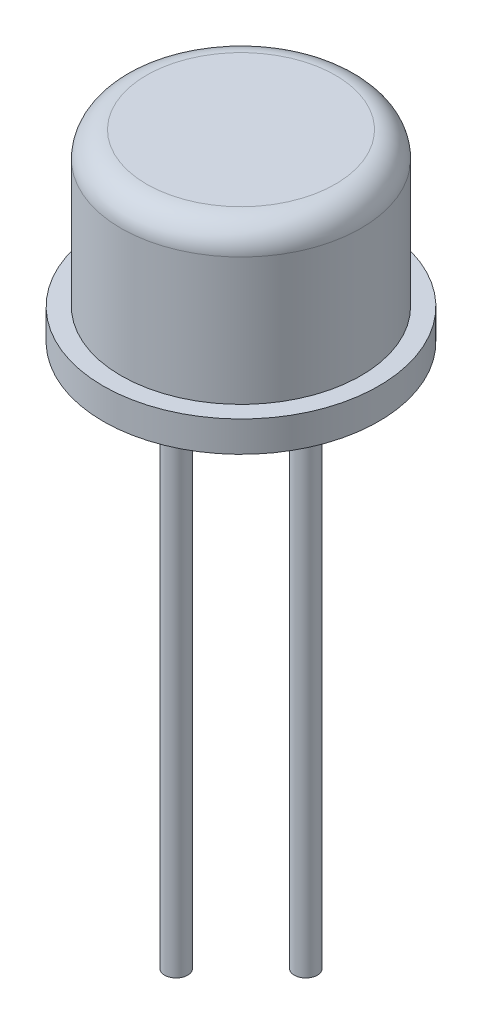
ISO-10303-21;
HEADER;
FILE_DESCRIPTION(('STEP AP214'),'2;1');
FILE_NAME('part.step','',(''),(''),'','','');
FILE_SCHEMA(('AUTOMOTIVE_DESIGN { 1 0 10303 214 1 1 1 1 }'));
ENDSEC;
DATA;
#1=APPLICATION_CONTEXT('core data for automotive mechanical design processes');
#2=APPLICATION_PROTOCOL_DEFINITION('international standard','automotive_design',2000,#1);
#3=PRODUCT_CONTEXT('',#1,'mechanical');
#4=PRODUCT('Part','Part','',(#3));
#5=PRODUCT_RELATED_PRODUCT_CATEGORY('part','',(#4));
#6=PRODUCT_DEFINITION_FORMATION('','',#4);
#7=PRODUCT_DEFINITION_CONTEXT('part definition',#1,'design');
#8=PRODUCT_DEFINITION('design','',#6,#7);
#9=PRODUCT_DEFINITION_SHAPE('','',#8);
#10=(LENGTH_UNIT() NAMED_UNIT(*) SI_UNIT(.MILLI.,.METRE.));
#11=(NAMED_UNIT(*) PLANE_ANGLE_UNIT() SI_UNIT($,.RADIAN.));
#12=(NAMED_UNIT(*) SI_UNIT($,.STERADIAN.) SOLID_ANGLE_UNIT());
#13=UNCERTAINTY_MEASURE_WITH_UNIT(LENGTH_MEASURE(1.E-05),#10,'distance_accuracy_value','');
#14=(GEOMETRIC_REPRESENTATION_CONTEXT(3) GLOBAL_UNCERTAINTY_ASSIGNED_CONTEXT((#13)) GLOBAL_UNIT_ASSIGNED_CONTEXT((#10,
#11,#12)) REPRESENTATION_CONTEXT('',''));
#15=CARTESIAN_POINT('',(0.,0.,0.));
#16=DIRECTION('',(0.,0.,1.));
#17=DIRECTION('',(1.,0.,0.));
#18=AXIS2_PLACEMENT_3D('',#15,#16,#17);
#19=CARTESIAN_POINT('',(0.,0.6,0.));
#20=DIRECTION('',(0.,-1.,0.));
#21=DIRECTION('',(0.,0.,-1.));
#22=AXIS2_PLACEMENT_3D('',#19,#20,#21);
#23=CYLINDRICAL_SURFACE('',#22,2.7);
#24=CARTESIAN_POINT('',(0.,0.6,0.));
#25=DIRECTION('',(0.,1.,0.));
#26=DIRECTION('',(0.,0.,1.));
#27=AXIS2_PLACEMENT_3D('',#24,#25,#26);
#28=CIRCLE('',#27,2.7);
#29=CARTESIAN_POINT('',(0.,0.6,2.7));
#30=VERTEX_POINT('',#29);
#31=EDGE_CURVE('E54',#30,#30,#28,.T.);
#32=ORIENTED_EDGE('',*,*,#31,.F.);
#33=EDGE_LOOP('',(#32));
#34=FACE_BOUND('',#33,.T.);
#35=CARTESIAN_POINT('',(0.,0.,0.));
#36=DIRECTION('',(0.,1.,0.));
#37=DIRECTION('',(0.,0.,1.));
#38=AXIS2_PLACEMENT_3D('',#35,#36,#37);
#39=CIRCLE('',#38,2.7);
#40=CARTESIAN_POINT('',(0.,0.,2.7));
#41=VERTEX_POINT('',#40);
#42=EDGE_CURVE('E51',#41,#41,#39,.T.);
#43=ORIENTED_EDGE('',*,*,#42,.T.);
#44=EDGE_LOOP('',(#43));
#45=FACE_BOUND('',#44,.T.);
#46=ADVANCED_FACE('F34',(#34,#45),#23,.T.);
#47=CARTESIAN_POINT('',(0.,0.6,0.));
#48=DIRECTION('',(0.,1.,0.));
#49=DIRECTION('',(0.,0.,1.));
#50=AXIS2_PLACEMENT_3D('',#47,#48,#49);
#51=PLANE('',#50);
#52=CARTESIAN_POINT('',(0.,0.6,0.));
#53=DIRECTION('',(0.,1.,0.));
#54=DIRECTION('',(0.,0.,1.));
#55=AXIS2_PLACEMENT_3D('',#52,#53,#54);
#56=CIRCLE('',#55,2.35);
#57=CARTESIAN_POINT('',(0.,0.6,2.35));
#58=VERTEX_POINT('',#57);
#59=EDGE_CURVE('E48',#58,#58,#56,.T.);
#60=ORIENTED_EDGE('',*,*,#59,.F.);
#61=EDGE_LOOP('',(#60));
#62=FACE_BOUND('',#61,.T.);
#63=ORIENTED_EDGE('',*,*,#31,.T.);
#64=EDGE_LOOP('',(#63));
#65=FACE_BOUND('',#64,.T.);
#66=ADVANCED_FACE('F90',(#62,#65),#51,.T.);
#67=CARTESIAN_POINT('',(0.,0.,0.));
#68=DIRECTION('',(0.,1.,0.));
#69=DIRECTION('',(0.,0.,1.));
#70=AXIS2_PLACEMENT_3D('',#67,#68,#69);
#71=PLANE('',#70);
#72=CARTESIAN_POINT('',(0.,0.,-1.27));
#73=DIRECTION('',(0.,1.,0.));
#74=DIRECTION('',(0.,0.,1.));
#75=AXIS2_PLACEMENT_3D('',#72,#73,#74);
#76=CIRCLE('',#75,0.225);
#77=CARTESIAN_POINT('',(0.,0.,-1.045));
#78=VERTEX_POINT('',#77);
#79=EDGE_CURVE('E10',#78,#78,#76,.F.);
#80=ORIENTED_EDGE('',*,*,#79,.F.);
#81=EDGE_LOOP('',(#80));
#82=FACE_BOUND('',#81,.T.);
#83=CARTESIAN_POINT('',(0.,0.,1.27));
#84=DIRECTION('',(0.,1.,0.));
#85=DIRECTION('',(0.,0.,1.));
#86=AXIS2_PLACEMENT_3D('',#83,#84,#85);
#87=CIRCLE('',#86,0.225);
#88=CARTESIAN_POINT('',(0.,0.,1.495));
#89=VERTEX_POINT('',#88);
#90=EDGE_CURVE('E40',#89,#89,#87,.F.);
#91=ORIENTED_EDGE('',*,*,#90,.F.);
#92=EDGE_LOOP('',(#91));
#93=FACE_BOUND('',#92,.T.);
#94=CARTESIAN_POINT('',(1.27,0.,0.));
#95=DIRECTION('',(0.,1.,0.));
#96=DIRECTION('',(0.,0.,1.));
#97=AXIS2_PLACEMENT_3D('',#94,#95,#96);
#98=CIRCLE('',#97,0.225);
#99=CARTESIAN_POINT('',(1.27,0.,0.225));
#100=VERTEX_POINT('',#99);
#101=EDGE_CURVE('E44',#100,#100,#98,.F.);
#102=ORIENTED_EDGE('',*,*,#101,.F.);
#103=EDGE_LOOP('',(#102));
#104=FACE_BOUND('',#103,.T.);
#105=ORIENTED_EDGE('',*,*,#42,.F.);
#106=EDGE_LOOP('',(#105));
#107=FACE_BOUND('',#106,.T.);
#108=ADVANCED_FACE('F95',(#82,#93,#104,#107),#71,.F.);
#109=CARTESIAN_POINT('',(0.,3.1,0.));
#110=DIRECTION('',(0.,1.,0.));
#111=DIRECTION('',(0.,0.,1.));
#112=AXIS2_PLACEMENT_3D('',#109,#110,#111);
#113=TOROIDAL_SURFACE('',#112,1.85,0.5);
#114=CARTESIAN_POINT('',(0.,3.6,0.));
#115=DIRECTION('',(0.,1.,0.));
#116=DIRECTION('',(0.,0.,1.));
#117=AXIS2_PLACEMENT_3D('',#114,#115,#116);
#118=CIRCLE('',#117,1.85);
#119=CARTESIAN_POINT('',(0.,3.6,1.85));
#120=VERTEX_POINT('',#119);
#121=EDGE_CURVE('E55',#120,#120,#118,.T.);
#122=ORIENTED_EDGE('',*,*,#121,.F.);
#123=EDGE_LOOP('',(#122));
#124=FACE_BOUND('',#123,.T.);
#125=CARTESIAN_POINT('',(0.,3.1,0.));
#126=DIRECTION('',(0.,1.,0.));
#127=DIRECTION('',(0.,0.,1.));
#128=AXIS2_PLACEMENT_3D('',#125,#126,#127);
#129=CIRCLE('',#128,2.35);
#130=CARTESIAN_POINT('',(0.,3.1,2.35));
#131=VERTEX_POINT('',#130);
#132=EDGE_CURVE('E60',#131,#131,#129,.T.);
#133=ORIENTED_EDGE('',*,*,#132,.T.);
#134=EDGE_LOOP('',(#133));
#135=FACE_BOUND('',#134,.T.);
#136=ADVANCED_FACE('F103',(#124,#135),#113,.T.);
#137=CARTESIAN_POINT('',(-1.85,3.6,0.));
#138=DIRECTION('',(0.,-1.,0.));
#139=DIRECTION('',(0.,0.,-1.));
#140=AXIS2_PLACEMENT_3D('',#137,#138,#139);
#141=PLANE('',#140);
#142=ORIENTED_EDGE('',*,*,#121,.T.);
#143=EDGE_LOOP('',(#142));
#144=FACE_BOUND('',#143,.T.);
#145=ADVANCED_FACE('F108',(#144),#141,.F.);
#146=CARTESIAN_POINT('',(0.,7.93686424326525,0.));
#147=DIRECTION('',(0.,1.,0.));
#148=DIRECTION('',(0.,0.,1.));
#149=AXIS2_PLACEMENT_3D('',#146,#147,#148);
#150=CYLINDRICAL_SURFACE('',#149,2.35);
#151=ORIENTED_EDGE('',*,*,#132,.F.);
#152=EDGE_LOOP('',(#151));
#153=FACE_BOUND('',#152,.T.);
#154=ORIENTED_EDGE('',*,*,#59,.T.);
#155=EDGE_LOOP('',(#154));
#156=FACE_BOUND('',#155,.T.);
#157=ADVANCED_FACE('F115',(#153,#156),#150,.T.);
#158=CARTESIAN_POINT('',(1.27,-10.,0.));
#159=DIRECTION('',(0.,1.,0.));
#160=DIRECTION('',(0.,0.,1.));
#161=AXIS2_PLACEMENT_3D('',#158,#159,#160);
#162=CYLINDRICAL_SURFACE('',#161,0.225);
#163=CARTESIAN_POINT('',(1.27,-10.,0.));
#164=DIRECTION('',(0.,-1.,0.));
#165=DIRECTION('',(0.,0.,-1.));
#166=AXIS2_PLACEMENT_3D('',#163,#164,#165);
#167=CIRCLE('',#166,0.225);
#168=CARTESIAN_POINT('',(1.27,-10.,-0.225));
#169=VERTEX_POINT('',#168);
#170=EDGE_CURVE('E65',#169,#169,#167,.T.);
#171=ORIENTED_EDGE('',*,*,#170,.F.);
#172=EDGE_LOOP('',(#171));
#173=FACE_BOUND('',#172,.T.);
#174=ORIENTED_EDGE('',*,*,#101,.T.);
#175=EDGE_LOOP('',(#174));
#176=FACE_BOUND('',#175,.T.);
#177=ADVANCED_FACE('F119',(#173,#176),#162,.T.);
#178=CARTESIAN_POINT('',(1.27,-10.,0.));
#179=DIRECTION('',(0.,-1.,0.));
#180=DIRECTION('',(0.,0.,-1.));
#181=AXIS2_PLACEMENT_3D('',#178,#179,#180);
#182=PLANE('',#181);
#183=ORIENTED_EDGE('',*,*,#170,.T.);
#184=EDGE_LOOP('',(#183));
#185=FACE_BOUND('',#184,.T.);
#186=ADVANCED_FACE('F123',(#185),#182,.T.);
#187=CARTESIAN_POINT('',(0.,-10.,1.27));
#188=DIRECTION('',(0.,1.,0.));
#189=DIRECTION('',(0.,0.,1.));
#190=AXIS2_PLACEMENT_3D('',#187,#188,#189);
#191=CYLINDRICAL_SURFACE('',#190,0.225);
#192=CARTESIAN_POINT('',(0.,-10.,1.27));
#193=DIRECTION('',(0.,-1.,0.));
#194=DIRECTION('',(0.,0.,-1.));
#195=AXIS2_PLACEMENT_3D('',#192,#193,#194);
#196=CIRCLE('',#195,0.225);
#197=CARTESIAN_POINT('',(0.,-10.,1.045));
#198=VERTEX_POINT('',#197);
#199=EDGE_CURVE('E68',#198,#198,#196,.T.);
#200=ORIENTED_EDGE('',*,*,#199,.F.);
#201=EDGE_LOOP('',(#200));
#202=FACE_BOUND('',#201,.T.);
#203=ORIENTED_EDGE('',*,*,#90,.T.);
#204=EDGE_LOOP('',(#203));
#205=FACE_BOUND('',#204,.T.);
#206=ADVANCED_FACE('F86',(#202,#205),#191,.T.);
#207=CARTESIAN_POINT('',(0.,-10.,1.27));
#208=DIRECTION('',(0.,-1.,0.));
#209=DIRECTION('',(0.,0.,-1.));
#210=AXIS2_PLACEMENT_3D('',#207,#208,#209);
#211=PLANE('',#210);
#212=ORIENTED_EDGE('',*,*,#199,.T.);
#213=EDGE_LOOP('',(#212));
#214=FACE_BOUND('',#213,.T.);
#215=ADVANCED_FACE('F79',(#214),#211,.T.);
#216=CARTESIAN_POINT('',(0.,-10.,-1.27));
#217=DIRECTION('',(0.,1.,0.));
#218=DIRECTION('',(0.,0.,1.));
#219=AXIS2_PLACEMENT_3D('',#216,#217,#218);
#220=CYLINDRICAL_SURFACE('',#219,0.225);
#221=CARTESIAN_POINT('',(0.,-10.,-1.27));
#222=DIRECTION('',(0.,-1.,0.));
#223=DIRECTION('',(0.,0.,-1.));
#224=AXIS2_PLACEMENT_3D('',#221,#222,#223);
#225=CIRCLE('',#224,0.225);
#226=CARTESIAN_POINT('',(0.,-10.,-1.495));
#227=VERTEX_POINT('',#226);
#228=EDGE_CURVE('E71',#227,#227,#225,.T.);
#229=ORIENTED_EDGE('',*,*,#228,.F.);
#230=EDGE_LOOP('',(#229));
#231=FACE_BOUND('',#230,.T.);
#232=ORIENTED_EDGE('',*,*,#79,.T.);
#233=EDGE_LOOP('',(#232));
#234=FACE_BOUND('',#233,.T.);
#235=ADVANCED_FACE('F77',(#231,#234),#220,.T.);
#236=CARTESIAN_POINT('',(0.,-10.,-1.27));
#237=DIRECTION('',(0.,-1.,0.));
#238=DIRECTION('',(0.,0.,-1.));
#239=AXIS2_PLACEMENT_3D('',#236,#237,#238);
#240=PLANE('',#239);
#241=ORIENTED_EDGE('',*,*,#228,.T.);
#242=EDGE_LOOP('',(#241));
#243=FACE_BOUND('',#242,.T.);
#244=ADVANCED_FACE('F75',(#243),#240,.T.);
#245=CLOSED_SHELL('',(#46,#66,#108,#136,#145,#157,#177,#186,#206,#215,#235,#244));
#246=MANIFOLD_SOLID_BREP('B2',#245);
#247=ADVANCED_BREP_SHAPE_REPRESENTATION('',(#18,#246),#14);
#248=SHAPE_DEFINITION_REPRESENTATION(#9,#247);
ENDSEC;
END-ISO-10303-21;
